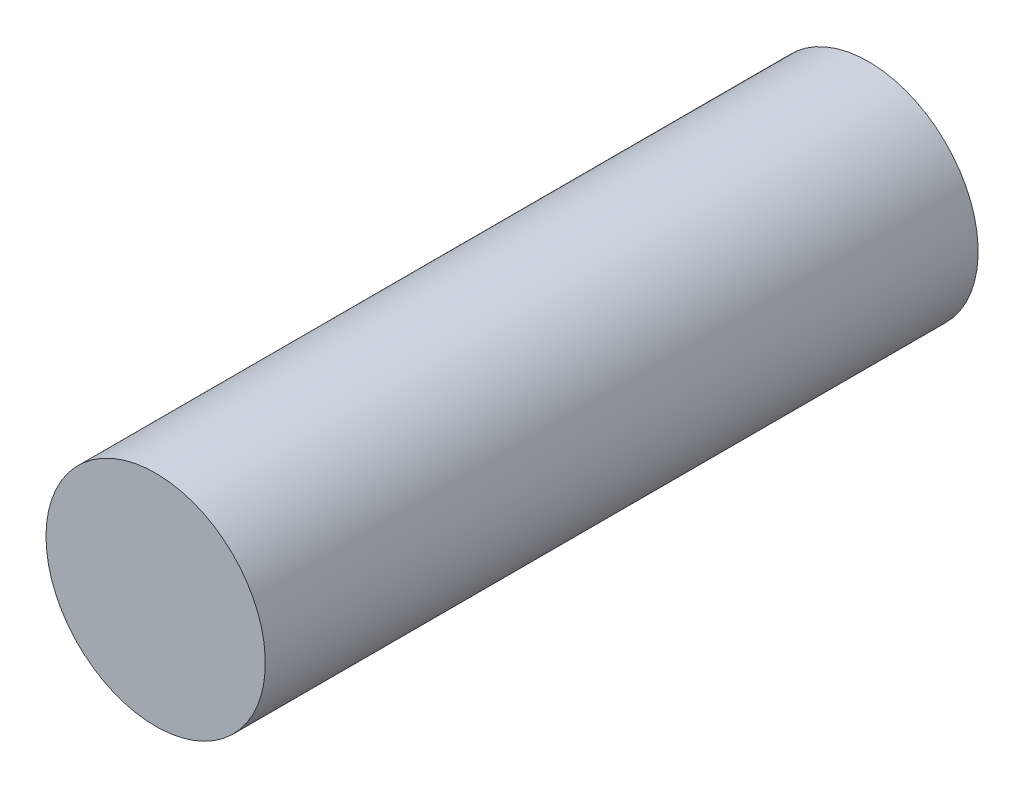
ISO-10303-21;
HEADER;
FILE_DESCRIPTION(('STEP AP214'),'2;1');
FILE_NAME('part.step','',(''),(''),'','','');
FILE_SCHEMA(('AUTOMOTIVE_DESIGN { 1 0 10303 214 1 1 1 1 }'));
ENDSEC;
DATA;
#1=APPLICATION_CONTEXT('core data for automotive mechanical design processes');
#2=APPLICATION_PROTOCOL_DEFINITION('international standard','automotive_design',2000,#1);
#3=PRODUCT_CONTEXT('',#1,'mechanical');
#4=PRODUCT('Part','Part','',(#3));
#5=PRODUCT_RELATED_PRODUCT_CATEGORY('part','',(#4));
#6=PRODUCT_DEFINITION_FORMATION('','',#4);
#7=PRODUCT_DEFINITION_CONTEXT('part definition',#1,'design');
#8=PRODUCT_DEFINITION('design','',#6,#7);
#9=PRODUCT_DEFINITION_SHAPE('','',#8);
#10=(LENGTH_UNIT() NAMED_UNIT(*) SI_UNIT(.MILLI.,.METRE.));
#11=(NAMED_UNIT(*) PLANE_ANGLE_UNIT() SI_UNIT($,.RADIAN.));
#12=(NAMED_UNIT(*) SI_UNIT($,.STERADIAN.) SOLID_ANGLE_UNIT());
#13=UNCERTAINTY_MEASURE_WITH_UNIT(LENGTH_MEASURE(1.E-05),#10,'distance_accuracy_value','');
#14=(GEOMETRIC_REPRESENTATION_CONTEXT(3) GLOBAL_UNCERTAINTY_ASSIGNED_CONTEXT((#13)) GLOBAL_UNIT_ASSIGNED_CONTEXT((#10,
#11,#12)) REPRESENTATION_CONTEXT('',''));
#15=CARTESIAN_POINT('',(0.,0.,0.));
#16=DIRECTION('',(0.,0.,1.));
#17=DIRECTION('',(1.,0.,0.));
#18=AXIS2_PLACEMENT_3D('',#15,#16,#17);
#19=CARTESIAN_POINT('',(0.,0.,58.));
#20=DIRECTION('',(0.,0.,-1.));
#21=DIRECTION('',(-1.,0.,0.));
#22=AXIS2_PLACEMENT_3D('',#19,#20,#21);
#23=CYLINDRICAL_SURFACE('',#22,4.);
#24=CARTESIAN_POINT('',(0.,0.,58.));
#25=DIRECTION('',(0.,0.,1.));
#26=DIRECTION('',(1.,0.,0.));
#27=AXIS2_PLACEMENT_3D('',#24,#25,#26);
#28=CIRCLE('',#27,4.);
#29=CARTESIAN_POINT('',(-4.,0.,58.));
#30=VERTEX_POINT('',#29);
#31=EDGE_CURVE('E10',#30,#30,#28,.T.);
#32=CARTESIAN_POINT('',(0.,0.,32.));
#33=DIRECTION('',(0.,0.,1.));
#34=DIRECTION('',(1.,0.,0.));
#35=AXIS2_PLACEMENT_3D('',#32,#33,#34);
#36=CIRCLE('',#35,4.);
#37=CARTESIAN_POINT('',(-4.,0.,32.));
#38=VERTEX_POINT('',#37);
#39=EDGE_CURVE('E39',#38,#38,#36,.T.);
#40=CARTESIAN_POINT('',(-4.,0.,58.));
#41=CARTESIAN_POINT('',(-4.,0.,57.7291666666667));
#42=CARTESIAN_POINT('',(-4.,0.,57.4583333333333));
#43=CARTESIAN_POINT('',(-4.,0.,56.9166666666667));
#44=CARTESIAN_POINT('',(-4.,0.,56.6458333333333));
#45=CARTESIAN_POINT('',(-4.,0.,56.1041666666667));
#46=CARTESIAN_POINT('',(-4.,0.,55.8333333333333));
#47=CARTESIAN_POINT('',(-4.,0.,55.2916666666667));
#48=CARTESIAN_POINT('',(-4.,0.,55.0208333333333));
#49=CARTESIAN_POINT('',(-4.,0.,54.4791666666667));
#50=CARTESIAN_POINT('',(-4.,0.,54.2083333333333));
#51=CARTESIAN_POINT('',(-4.,0.,53.6666666666667));
#52=CARTESIAN_POINT('',(-4.,0.,53.3958333333333));
#53=CARTESIAN_POINT('',(-4.,0.,52.8541666666667));
#54=CARTESIAN_POINT('',(-4.,0.,52.5833333333333));
#55=CARTESIAN_POINT('',(-4.,0.,52.0416666666667));
#56=CARTESIAN_POINT('',(-4.,0.,51.7708333333333));
#57=CARTESIAN_POINT('',(-4.,0.,51.2291666666667));
#58=CARTESIAN_POINT('',(-4.,0.,50.9583333333333));
#59=CARTESIAN_POINT('',(-4.,0.,50.4166666666667));
#60=CARTESIAN_POINT('',(-4.,0.,50.1458333333333));
#61=CARTESIAN_POINT('',(-4.,0.,49.6041666666667));
#62=CARTESIAN_POINT('',(-4.,0.,49.3333333333333));
#63=CARTESIAN_POINT('',(-4.,0.,48.7916666666667));
#64=CARTESIAN_POINT('',(-4.,0.,48.5208333333333));
#65=CARTESIAN_POINT('',(-4.,0.,47.9791666666667));
#66=CARTESIAN_POINT('',(-4.,0.,47.7083333333333));
#67=CARTESIAN_POINT('',(-4.,0.,47.1666666666667));
#68=CARTESIAN_POINT('',(-4.,0.,46.8958333333333));
#69=CARTESIAN_POINT('',(-4.,0.,46.3541666666667));
#70=CARTESIAN_POINT('',(-4.,0.,46.0833333333333));
#71=CARTESIAN_POINT('',(-4.,0.,45.5416666666667));
#72=CARTESIAN_POINT('',(-4.,0.,45.2708333333333));
#73=CARTESIAN_POINT('',(-4.,0.,44.7291666666667));
#74=CARTESIAN_POINT('',(-4.,0.,44.4583333333333));
#75=CARTESIAN_POINT('',(-4.,0.,43.9166666666667));
#76=CARTESIAN_POINT('',(-4.,0.,43.6458333333333));
#77=CARTESIAN_POINT('',(-4.,0.,43.1041666666667));
#78=CARTESIAN_POINT('',(-4.,0.,42.8333333333333));
#79=CARTESIAN_POINT('',(-4.,0.,42.2916666666667));
#80=CARTESIAN_POINT('',(-4.,0.,42.0208333333333));
#81=CARTESIAN_POINT('',(-4.,0.,41.4791666666667));
#82=CARTESIAN_POINT('',(-4.,0.,41.2083333333333));
#83=CARTESIAN_POINT('',(-4.,0.,40.6666666666667));
#84=CARTESIAN_POINT('',(-4.,0.,40.3958333333333));
#85=CARTESIAN_POINT('',(-4.,0.,39.8541666666667));
#86=CARTESIAN_POINT('',(-4.,0.,39.5833333333333));
#87=CARTESIAN_POINT('',(-4.,0.,39.0416666666667));
#88=CARTESIAN_POINT('',(-4.,0.,38.7708333333333));
#89=CARTESIAN_POINT('',(-4.,0.,38.2291666666667));
#90=CARTESIAN_POINT('',(-4.,0.,37.9583333333333));
#91=CARTESIAN_POINT('',(-4.,0.,37.4166666666667));
#92=CARTESIAN_POINT('',(-4.,0.,37.1458333333333));
#93=CARTESIAN_POINT('',(-4.,0.,36.6041666666667));
#94=CARTESIAN_POINT('',(-4.,0.,36.3333333333333));
#95=CARTESIAN_POINT('',(-4.,0.,35.7916666666667));
#96=CARTESIAN_POINT('',(-4.,0.,35.5208333333333));
#97=CARTESIAN_POINT('',(-4.,0.,34.9791666666667));
#98=CARTESIAN_POINT('',(-4.,0.,34.7083333333333));
#99=CARTESIAN_POINT('',(-4.,0.,34.1666666666667));
#100=CARTESIAN_POINT('',(-4.,0.,33.8958333333333));
#101=CARTESIAN_POINT('',(-4.,0.,33.3541666666667));
#102=CARTESIAN_POINT('',(-4.,0.,33.0833333333333));
#103=CARTESIAN_POINT('',(-4.,0.,32.5416666666667));
#104=CARTESIAN_POINT('',(-4.,0.,32.2708333333333));
#105=CARTESIAN_POINT('',(-4.,0.,32.));
#106=B_SPLINE_CURVE_WITH_KNOTS('',3,(#40,#41,#42,#43,#44,#45,#46,#47,#48,#49,#50,#51,#52,#53,
#54,#55,#56,#57,#58,#59,#60,#61,#62,#63,#64,#65,#66,#67,#68,#69,#70,#71,#72,#73,#74,#75,#76,#77,
#78,#79,#80,#81,#82,#83,#84,#85,#86,#87,#88,#89,#90,#91,#92,#93,#94,#95,#96,#97,#98,#99,#100,
#101,#102,#103,#104,#105),.UNSPECIFIED.,.F.,.F.,(4,2,2,2,2,2,2,2,2,2,2,2,2,2,2,2,2,2,2,2,2,2,2,
2,2,2,2,2,2,2,2,2,4),(0.,0.812499999999994,1.62499999999999,2.4375,3.25,4.0625,4.875,5.6875,6.5,
7.31249999999999,8.12499999999999,8.93749999999999,9.74999999999999,10.5625,11.375,12.1875,13.,
13.8125,14.625,15.4375,16.25,17.0625,17.875,18.6875,19.5,20.3125,21.125,21.9375,22.75,23.5625,
24.375,25.1875,26.),.UNSPECIFIED.);
#107=EDGE_CURVE('BSEAM36',#30,#38,#106,.T.);
#108=ORIENTED_EDGE('',*,*,#31,.F.);
#109=ORIENTED_EDGE('',*,*,#39,.T.);
#110=ORIENTED_EDGE('',*,*,#107,.T.);
#111=ORIENTED_EDGE('',*,*,#107,.F.);
#112=EDGE_LOOP('',(#108,#110,#109,#111));
#113=FACE_BOUND('',#112,.T.);
#114=ADVANCED_FACE('F36',(#113),#23,.T.);
#115=CARTESIAN_POINT('',(0.,0.,58.));
#116=DIRECTION('',(0.,0.,1.));
#117=DIRECTION('',(1.,0.,0.));
#118=AXIS2_PLACEMENT_3D('',#115,#116,#117);
#119=PLANE('',#118);
#120=ORIENTED_EDGE('',*,*,#31,.T.);
#121=EDGE_LOOP('',(#120));
#122=FACE_BOUND('',#121,.T.);
#123=ADVANCED_FACE('F53',(#122),#119,.T.);
#124=CARTESIAN_POINT('',(0.,0.,32.));
#125=DIRECTION('',(0.,0.,1.));
#126=DIRECTION('',(1.,0.,0.));
#127=AXIS2_PLACEMENT_3D('',#124,#125,#126);
#128=PLANE('',#127);
#129=ORIENTED_EDGE('',*,*,#39,.F.);
#130=EDGE_LOOP('',(#129));
#131=FACE_BOUND('',#130,.T.);
#132=ADVANCED_FACE('F51',(#131),#128,.F.);
#133=CLOSED_SHELL('',(#114,#123,#132));
#134=MANIFOLD_SOLID_BREP('B2',#133);
#135=ADVANCED_BREP_SHAPE_REPRESENTATION('',(#18,#134),#14);
#136=SHAPE_DEFINITION_REPRESENTATION(#9,#135);
ENDSEC;
END-ISO-10303-21;
